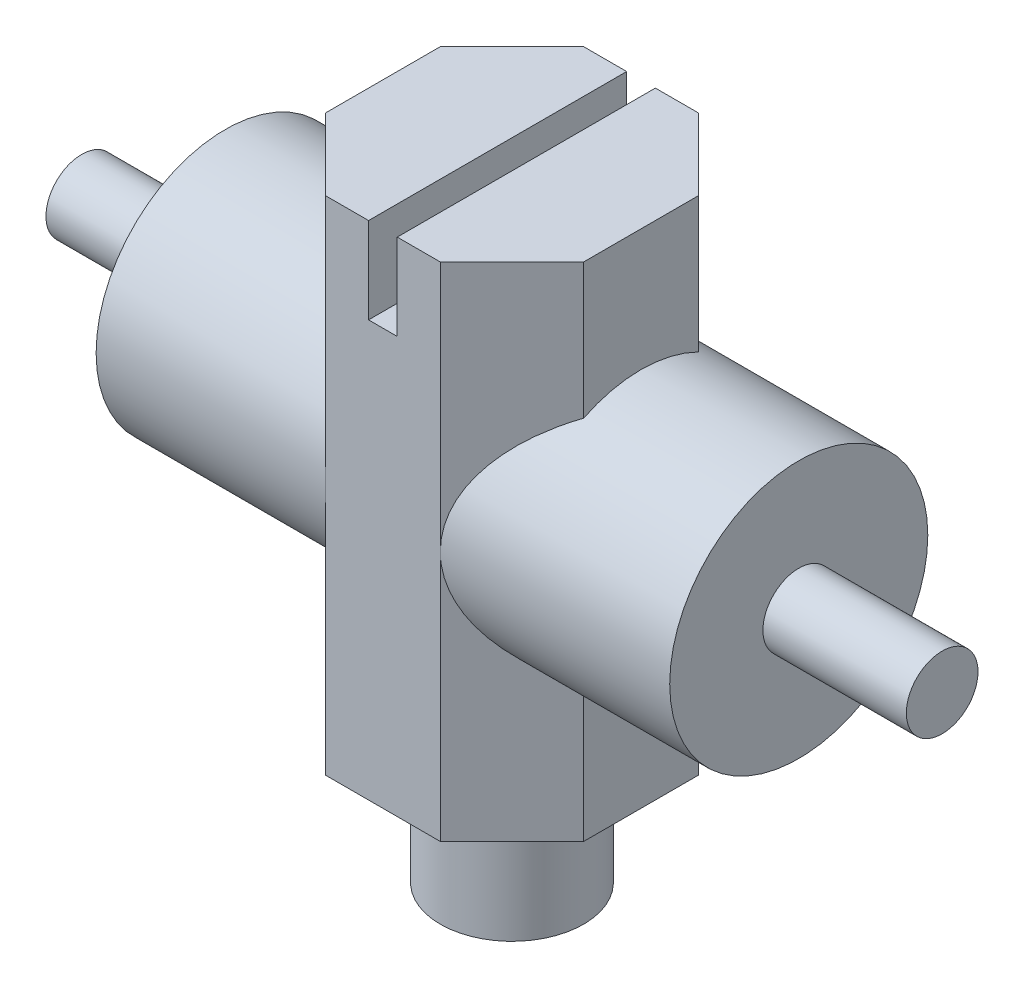
ISO-10303-21;
HEADER;
FILE_DESCRIPTION(('STEP AP214'),'2;1');
FILE_NAME('part.step','',(''),(''),'','','');
FILE_SCHEMA(('AUTOMOTIVE_DESIGN { 1 0 10303 214 1 1 1 1 }'));
ENDSEC;
DATA;
#1=APPLICATION_CONTEXT('core data for automotive mechanical design processes');
#2=APPLICATION_PROTOCOL_DEFINITION('international standard','automotive_design',2000,#1);
#3=PRODUCT_CONTEXT('',#1,'mechanical');
#4=PRODUCT('Part','Part','',(#3));
#5=PRODUCT_RELATED_PRODUCT_CATEGORY('part','',(#4));
#6=PRODUCT_DEFINITION_FORMATION('','',#4);
#7=PRODUCT_DEFINITION_CONTEXT('part definition',#1,'design');
#8=PRODUCT_DEFINITION('design','',#6,#7);
#9=PRODUCT_DEFINITION_SHAPE('','',#8);
#10=(LENGTH_UNIT() NAMED_UNIT(*) SI_UNIT(.MILLI.,.METRE.));
#11=(NAMED_UNIT(*) PLANE_ANGLE_UNIT() SI_UNIT($,.RADIAN.));
#12=(NAMED_UNIT(*) SI_UNIT($,.STERADIAN.) SOLID_ANGLE_UNIT());
#13=UNCERTAINTY_MEASURE_WITH_UNIT(LENGTH_MEASURE(1.E-05),#10,'distance_accuracy_value','');
#14=(GEOMETRIC_REPRESENTATION_CONTEXT(3) GLOBAL_UNCERTAINTY_ASSIGNED_CONTEXT((#13)) GLOBAL_UNIT_ASSIGNED_CONTEXT((#10,
#11,#12)) REPRESENTATION_CONTEXT('',''));
#15=CARTESIAN_POINT('',(0.,0.,0.));
#16=DIRECTION('',(0.,0.,1.));
#17=DIRECTION('',(1.,0.,0.));
#18=AXIS2_PLACEMENT_3D('',#15,#16,#17);
#19=CARTESIAN_POINT('',(0.,175.,0.));
#20=DIRECTION('',(0.,1.,0.));
#21=DIRECTION('',(0.,0.,1.));
#22=AXIS2_PLACEMENT_3D('',#19,#20,#21);
#23=PLANE('',#22);
#24=DIRECTION('',(0.,0.,1.));
#25=VECTOR('',#24,1.);
#26=CARTESIAN_POINT('',(290.,175.,-90.));
#27=LINE('',#26,#25);
#28=CARTESIAN_POINT('',(290.,175.,-90.));
#29=VERTEX_POINT('',#28);
#30=CARTESIAN_POINT('',(290.,175.,90.));
#31=VERTEX_POINT('',#30);
#32=EDGE_CURVE('E172',#29,#31,#27,.T.);
#33=ORIENTED_EDGE('',*,*,#32,.F.);
#34=DIRECTION('',(-1.,0.,0.));
#35=VECTOR('',#34,1.);
#36=CARTESIAN_POINT('',(210.,175.,-90.));
#37=LINE('',#36,#35);
#38=CARTESIAN_POINT('',(260.,175.,-90.));
#39=VERTEX_POINT('',#38);
#40=EDGE_CURVE('E222',#29,#39,#37,.T.);
#41=ORIENTED_EDGE('',*,*,#40,.T.);
#42=DIRECTION('',(0.707106781186549,0.,-0.707106781186546));
#43=VECTOR('',#42,1.);
#44=CARTESIAN_POINT('',(84.9999999999995,175.,84.9999999999998));
#45=LINE('',#44,#43);
#46=CARTESIAN_POINT('',(210.,175.,-40.0000000000002));
#47=VERTEX_POINT('',#46);
#48=EDGE_CURVE('E274',#39,#47,#45,.F.);
#49=ORIENTED_EDGE('',*,*,#48,.T.);
#50=DIRECTION('',(0.,0.,1.));
#51=VECTOR('',#50,1.);
#52=CARTESIAN_POINT('',(210.,175.,-90.));
#53=LINE('',#52,#51);
#54=CARTESIAN_POINT('',(210.,175.,39.9999999999998));
#55=VERTEX_POINT('',#54);
#56=EDGE_CURVE('E212',#47,#55,#53,.T.);
#57=ORIENTED_EDGE('',*,*,#56,.T.);
#58=DIRECTION('',(-0.707106781186546,0.,-0.707106781186549));
#59=VECTOR('',#58,1.);
#60=CARTESIAN_POINT('',(85.0000000000005,175.,-85.0000000000002));
#61=LINE('',#60,#59);
#62=CARTESIAN_POINT('',(260.,175.,90.));
#63=VERTEX_POINT('',#62);
#64=EDGE_CURVE('E278',#55,#63,#61,.F.);
#65=ORIENTED_EDGE('',*,*,#64,.T.);
#66=DIRECTION('',(1.,0.,0.));
#67=VECTOR('',#66,1.);
#68=CARTESIAN_POINT('',(210.,175.,90.));
#69=LINE('',#68,#67);
#70=EDGE_CURVE('E217',#63,#31,#69,.T.);
#71=ORIENTED_EDGE('',*,*,#70,.T.);
#72=EDGE_LOOP('',(#33,#41,#49,#57,#65,#71));
#73=FACE_BOUND('',#72,.T.);
#74=ADVANCED_FACE('F41',(#73),#23,.T.);
#75=CARTESIAN_POINT('',(0.,0.,0.));
#76=DIRECTION('',(1.,0.,0.));
#77=DIRECTION('',(0.,0.,-1.));
#78=AXIS2_PLACEMENT_3D('',#75,#76,#77);
#79=CYLINDRICAL_SURFACE('',#78,90.);
#80=CARTESIAN_POINT('',(100.,0.,0.));
#81=DIRECTION('',(1.,0.,0.));
#82=DIRECTION('',(0.,0.,-1.));
#83=AXIS2_PLACEMENT_3D('',#80,#81,#82);
#84=CIRCLE('',#83,90.);
#85=CARTESIAN_POINT('',(100.,0.,-90.));
#86=VERTEX_POINT('',#85);
#87=EDGE_CURVE('E245',#86,#86,#84,.T.);
#88=ORIENTED_EDGE('',*,*,#87,.T.);
#89=EDGE_LOOP('',(#88));
#90=FACE_BOUND('',#89,.T.);
#91=CARTESIAN_POINT('',(210.,0.,0.));
#92=DIRECTION('',(1.,0.,0.));
#93=DIRECTION('',(0.,0.,-1.));
#94=AXIS2_PLACEMENT_3D('',#91,#92,#93);
#95=CIRCLE('',#94,90.);
#96=CARTESIAN_POINT('',(210.,-80.6225774829854,-40.0000000000002));
#97=VERTEX_POINT('',#96);
#98=CARTESIAN_POINT('',(210.,-80.6225774829856,39.9999999999999));
#99=VERTEX_POINT('',#98);
#100=EDGE_CURVE('E211',#97,#99,#95,.F.);
#101=ORIENTED_EDGE('',*,*,#100,.T.);
#102=CARTESIAN_POINT('',(170.,0.,0.));
#103=DIRECTION('',(0.707106781186549,0.,-0.707106781186546));
#104=DIRECTION('',(0.707106781186546,0.,0.707106781186549));
#105=AXIS2_PLACEMENT_3D('',#102,#103,#104);
#106=ELLIPSE('',#105,127.279220613578,90.);
#107=CARTESIAN_POINT('',(260.,0.,90.));
#108=VERTEX_POINT('',#107);
#109=EDGE_CURVE('E320',#99,#108,#106,.F.);
#110=ORIENTED_EDGE('',*,*,#109,.T.);
#111=CARTESIAN_POINT('',(170.,0.,0.));
#112=DIRECTION('',(0.707106781186549,0.,-0.707106781186546));
#113=DIRECTION('',(0.707106781186546,0.,0.707106781186549));
#114=AXIS2_PLACEMENT_3D('',#111,#112,#113);
#115=ELLIPSE('',#114,127.279220613578,90.);
#116=CARTESIAN_POINT('',(210.,80.6225774829856,39.9999999999999));
#117=VERTEX_POINT('',#116);
#118=EDGE_CURVE('E318',#108,#117,#115,.F.);
#119=ORIENTED_EDGE('',*,*,#118,.T.);
#120=CARTESIAN_POINT('',(210.,80.6225774829854,-40.0000000000002));
#121=VERTEX_POINT('',#120);
#122=EDGE_CURVE('E257',#117,#121,#95,.F.);
#123=ORIENTED_EDGE('',*,*,#122,.T.);
#124=CARTESIAN_POINT('',(170.,0.,0.));
#125=DIRECTION('',(0.707106781186546,0.,0.707106781186549));
#126=DIRECTION('',(0.707106781186549,0.,-0.707106781186546));
#127=AXIS2_PLACEMENT_3D('',#124,#125,#126);
#128=ELLIPSE('',#127,127.279220613579,90.);
#129=CARTESIAN_POINT('',(260.,0.,-90.));
#130=VERTEX_POINT('',#129);
#131=EDGE_CURVE('E50',#121,#130,#128,.F.);
#132=ORIENTED_EDGE('',*,*,#131,.T.);
#133=CARTESIAN_POINT('',(170.,0.,0.));
#134=DIRECTION('',(0.707106781186546,0.,0.707106781186549));
#135=DIRECTION('',(0.707106781186549,0.,-0.707106781186546));
#136=AXIS2_PLACEMENT_3D('',#133,#134,#135);
#137=ELLIPSE('',#136,127.279220613579,90.);
#138=EDGE_CURVE('E11',#130,#97,#137,.F.);
#139=ORIENTED_EDGE('',*,*,#138,.T.);
#140=EDGE_LOOP('',(#101,#110,#119,#123,#132,#139));
#141=FACE_BOUND('',#140,.T.);
#142=ADVANCED_FACE('F328',(#90,#141),#79,.T.);
#143=CARTESIAN_POINT('',(0.,0.,0.));
#144=DIRECTION('',(-1.,0.,0.));
#145=DIRECTION('',(0.,0.,1.));
#146=AXIS2_PLACEMENT_3D('',#143,#144,#145);
#147=PLANE('',#146);
#148=CARTESIAN_POINT('',(0.,0.,0.));
#149=DIRECTION('',(1.,0.,0.));
#150=DIRECTION('',(0.,0.,-1.));
#151=AXIS2_PLACEMENT_3D('',#148,#149,#150);
#152=CIRCLE('',#151,25.);
#153=CARTESIAN_POINT('',(0.,0.,-25.));
#154=VERTEX_POINT('',#153);
#155=EDGE_CURVE('E251',#154,#154,#152,.T.);
#156=ORIENTED_EDGE('',*,*,#155,.F.);
#157=EDGE_LOOP('',(#156));
#158=FACE_BOUND('',#157,.T.);
#159=ADVANCED_FACE('F396',(#158),#147,.T.);
#160=CARTESIAN_POINT('',(0.,0.,0.));
#161=DIRECTION('',(1.,0.,0.));
#162=DIRECTION('',(0.,0.,-1.));
#163=AXIS2_PLACEMENT_3D('',#160,#161,#162);
#164=CYLINDRICAL_SURFACE('',#163,25.);
#165=ORIENTED_EDGE('',*,*,#155,.T.);
#166=EDGE_LOOP('',(#165));
#167=FACE_BOUND('',#166,.T.);
#168=CARTESIAN_POINT('',(100.,0.,0.));
#169=DIRECTION('',(1.,0.,0.));
#170=DIRECTION('',(0.,0.,-1.));
#171=AXIS2_PLACEMENT_3D('',#168,#169,#170);
#172=CIRCLE('',#171,25.);
#173=CARTESIAN_POINT('',(100.,0.,-25.));
#174=VERTEX_POINT('',#173);
#175=EDGE_CURVE('E248',#174,#174,#172,.T.);
#176=ORIENTED_EDGE('',*,*,#175,.F.);
#177=EDGE_LOOP('',(#176));
#178=FACE_BOUND('',#177,.T.);
#179=ADVANCED_FACE('F480',(#167,#178),#164,.T.);
#180=CARTESIAN_POINT('',(100.,25.,0.));
#181=DIRECTION('',(-1.,0.,0.));
#182=DIRECTION('',(0.,0.,1.));
#183=AXIS2_PLACEMENT_3D('',#180,#181,#182);
#184=PLANE('',#183);
#185=ORIENTED_EDGE('',*,*,#175,.T.);
#186=EDGE_LOOP('',(#185));
#187=FACE_BOUND('',#186,.T.);
#188=ORIENTED_EDGE('',*,*,#87,.F.);
#189=EDGE_LOOP('',(#188));
#190=FACE_BOUND('',#189,.T.);
#191=ADVANCED_FACE('F477',(#187,#190),#184,.T.);
#192=CARTESIAN_POINT('',(210.,175.,-90.));
#193=DIRECTION('',(1.,0.,0.));
#194=DIRECTION('',(0.,0.,-1.));
#195=AXIS2_PLACEMENT_3D('',#192,#193,#194);
#196=PLANE('',#195);
#197=DIRECTION('',(0.,0.,1.));
#198=VECTOR('',#197,1.);
#199=CARTESIAN_POINT('',(210.,-175.,-90.));
#200=LINE('',#199,#198);
#201=CARTESIAN_POINT('',(210.,-175.,-40.0000000000002));
#202=VERTEX_POINT('',#201);
#203=CARTESIAN_POINT('',(210.,-175.,39.9999999999998));
#204=VERTEX_POINT('',#203);
#205=EDGE_CURVE('E206',#202,#204,#200,.T.);
#206=ORIENTED_EDGE('',*,*,#205,.T.);
#207=DIRECTION('',(0.,1.,0.));
#208=VECTOR('',#207,1.);
#209=CARTESIAN_POINT('',(210.,175.,39.9999999999999));
#210=LINE('',#209,#208);
#211=EDGE_CURVE('E301',#204,#99,#210,.T.);
#212=ORIENTED_EDGE('',*,*,#211,.T.);
#213=ORIENTED_EDGE('',*,*,#100,.F.);
#214=DIRECTION('',(0.,-1.,0.));
#215=VECTOR('',#214,1.);
#216=CARTESIAN_POINT('',(210.,175.,-40.0000000000002));
#217=LINE('',#216,#215);
#218=EDGE_CURVE('E299',#97,#202,#217,.T.);
#219=ORIENTED_EDGE('',*,*,#218,.T.);
#220=EDGE_LOOP('',(#206,#212,#213,#219));
#221=FACE_BOUND('',#220,.T.);
#222=ADVANCED_FACE('F377',(#221),#196,.F.);
#223=CARTESIAN_POINT('',(210.,175.,90.));
#224=DIRECTION('',(0.,0.,-1.));
#225=DIRECTION('',(-1.,0.,0.));
#226=AXIS2_PLACEMENT_3D('',#223,#224,#225);
#227=PLANE('',#226);
#228=DIRECTION('',(1.,0.,0.));
#229=VECTOR('',#228,1.);
#230=CARTESIAN_POINT('',(290.,115.,90.));
#231=LINE('',#230,#229);
#232=CARTESIAN_POINT('',(290.,115.,90.));
#233=VERTEX_POINT('',#232);
#234=CARTESIAN_POINT('',(310.,115.,90.));
#235=VERTEX_POINT('',#234);
#236=EDGE_CURVE('E183',#233,#235,#231,.T.);
#237=ORIENTED_EDGE('',*,*,#236,.F.);
#238=DIRECTION('',(0.,1.,0.));
#239=VECTOR('',#238,1.);
#240=CARTESIAN_POINT('',(290.,115.,90.));
#241=LINE('',#240,#239);
#242=EDGE_CURVE('E166',#233,#31,#241,.T.);
#243=ORIENTED_EDGE('',*,*,#242,.T.);
#244=ORIENTED_EDGE('',*,*,#70,.F.);
#245=DIRECTION('',(0.,-1.,0.));
#246=VECTOR('',#245,1.);
#247=CARTESIAN_POINT('',(260.,175.,90.));
#248=LINE('',#247,#246);
#249=EDGE_CURVE('E266',#63,#108,#248,.T.);
#250=ORIENTED_EDGE('',*,*,#249,.T.);
#251=DIRECTION('',(0.,-1.,0.));
#252=VECTOR('',#251,1.);
#253=CARTESIAN_POINT('',(260.,175.,90.));
#254=LINE('',#253,#252);
#255=CARTESIAN_POINT('',(260.,-175.,90.));
#256=VERTEX_POINT('',#255);
#257=EDGE_CURVE('E264',#108,#256,#254,.T.);
#258=ORIENTED_EDGE('',*,*,#257,.T.);
#259=DIRECTION('',(1.,0.,0.));
#260=VECTOR('',#259,1.);
#261=CARTESIAN_POINT('',(210.,-175.,90.));
#262=LINE('',#261,#260);
#263=CARTESIAN_POINT('',(340.,-175.,90.));
#264=VERTEX_POINT('',#263);
#265=EDGE_CURVE('E229',#256,#264,#262,.T.);
#266=ORIENTED_EDGE('',*,*,#265,.T.);
#267=DIRECTION('',(0.,1.,0.));
#268=VECTOR('',#267,1.);
#269=CARTESIAN_POINT('',(340.,175.,90.));
#270=LINE('',#269,#268);
#271=CARTESIAN_POINT('',(340.,0.,90.));
#272=VERTEX_POINT('',#271);
#273=EDGE_CURVE('E269',#264,#272,#270,.T.);
#274=ORIENTED_EDGE('',*,*,#273,.T.);
#275=DIRECTION('',(0.,1.,0.));
#276=VECTOR('',#275,1.);
#277=CARTESIAN_POINT('',(340.,175.,90.));
#278=LINE('',#277,#276);
#279=CARTESIAN_POINT('',(340.,175.,90.));
#280=VERTEX_POINT('',#279);
#281=EDGE_CURVE('E271',#272,#280,#278,.T.);
#282=ORIENTED_EDGE('',*,*,#281,.T.);
#283=CARTESIAN_POINT('',(310.,175.,90.));
#284=VERTEX_POINT('',#283);
#285=EDGE_CURVE('E215',#284,#280,#69,.T.);
#286=ORIENTED_EDGE('',*,*,#285,.F.);
#287=DIRECTION('',(0.,1.,0.));
#288=VECTOR('',#287,1.);
#289=CARTESIAN_POINT('',(310.,115.,90.));
#290=LINE('',#289,#288);
#291=EDGE_CURVE('E57',#235,#284,#290,.T.);
#292=ORIENTED_EDGE('',*,*,#291,.F.);
#293=EDGE_LOOP('',(#237,#243,#244,#250,#258,#266,#274,#282,#286,#292));
#294=FACE_BOUND('',#293,.T.);
#295=ADVANCED_FACE('F188',(#294),#227,.F.);
#296=CARTESIAN_POINT('',(390.,175.,-90.));
#297=DIRECTION('',(-1.,0.,0.));
#298=DIRECTION('',(0.,0.,1.));
#299=AXIS2_PLACEMENT_3D('',#296,#297,#298);
#300=PLANE('',#299);
#301=CARTESIAN_POINT('',(390.,0.,0.));
#302=DIRECTION('',(-1.,0.,0.));
#303=DIRECTION('',(0.,0.,1.));
#304=AXIS2_PLACEMENT_3D('',#301,#302,#303);
#305=CIRCLE('',#304,90.);
#306=CARTESIAN_POINT('',(390.,-80.6225774829854,40.0000000000002));
#307=VERTEX_POINT('',#306);
#308=CARTESIAN_POINT('',(390.,-80.6225774829855,-40.));
#309=VERTEX_POINT('',#308);
#310=EDGE_CURVE('E255',#307,#309,#305,.F.);
#311=ORIENTED_EDGE('',*,*,#310,.F.);
#312=DIRECTION('',(0.,-1.,0.));
#313=VECTOR('',#312,1.);
#314=CARTESIAN_POINT('',(390.,175.,40.0000000000002));
#315=LINE('',#314,#313);
#316=CARTESIAN_POINT('',(390.,-175.,40.0000000000001));
#317=VERTEX_POINT('',#316);
#318=EDGE_CURVE('E284',#307,#317,#315,.T.);
#319=ORIENTED_EDGE('',*,*,#318,.T.);
#320=DIRECTION('',(0.,0.,-1.));
#321=VECTOR('',#320,1.);
#322=CARTESIAN_POINT('',(390.,-175.,-90.));
#323=LINE('',#322,#321);
#324=CARTESIAN_POINT('',(390.,-175.,-40.));
#325=VERTEX_POINT('',#324);
#326=EDGE_CURVE('E232',#317,#325,#323,.T.);
#327=ORIENTED_EDGE('',*,*,#326,.T.);
#328=DIRECTION('',(0.,1.,0.));
#329=VECTOR('',#328,1.);
#330=CARTESIAN_POINT('',(390.,175.,-40.));
#331=LINE('',#330,#329);
#332=EDGE_CURVE('E282',#325,#309,#331,.T.);
#333=ORIENTED_EDGE('',*,*,#332,.T.);
#334=EDGE_LOOP('',(#311,#319,#327,#333));
#335=FACE_BOUND('',#334,.T.);
#336=ADVANCED_FACE('F355',(#335),#300,.F.);
#337=CARTESIAN_POINT('',(210.,175.,-90.));
#338=DIRECTION('',(0.,0.,1.));
#339=DIRECTION('',(1.,0.,0.));
#340=AXIS2_PLACEMENT_3D('',#337,#338,#339);
#341=PLANE('',#340);
#342=ORIENTED_EDGE('',*,*,#40,.F.);
#343=DIRECTION('',(0.,1.,0.));
#344=VECTOR('',#343,1.);
#345=CARTESIAN_POINT('',(290.,115.,-90.));
#346=LINE('',#345,#344);
#347=CARTESIAN_POINT('',(290.,115.,-90.));
#348=VERTEX_POINT('',#347);
#349=EDGE_CURVE('E197',#348,#29,#346,.T.);
#350=ORIENTED_EDGE('',*,*,#349,.F.);
#351=DIRECTION('',(-1.,0.,0.));
#352=VECTOR('',#351,1.);
#353=CARTESIAN_POINT('',(290.,115.,-90.));
#354=LINE('',#353,#352);
#355=CARTESIAN_POINT('',(310.,115.,-90.));
#356=VERTEX_POINT('',#355);
#357=EDGE_CURVE('E177',#356,#348,#354,.T.);
#358=ORIENTED_EDGE('',*,*,#357,.F.);
#359=DIRECTION('',(0.,1.,0.));
#360=VECTOR('',#359,1.);
#361=CARTESIAN_POINT('',(310.,115.,-90.));
#362=LINE('',#361,#360);
#363=CARTESIAN_POINT('',(310.,175.,-90.));
#364=VERTEX_POINT('',#363);
#365=EDGE_CURVE('E200',#356,#364,#362,.T.);
#366=ORIENTED_EDGE('',*,*,#365,.T.);
#367=CARTESIAN_POINT('',(340.,175.,-90.));
#368=VERTEX_POINT('',#367);
#369=EDGE_CURVE('E223',#368,#364,#37,.T.);
#370=ORIENTED_EDGE('',*,*,#369,.F.);
#371=DIRECTION('',(0.,-1.,0.));
#372=VECTOR('',#371,1.);
#373=CARTESIAN_POINT('',(340.,175.,-90.));
#374=LINE('',#373,#372);
#375=CARTESIAN_POINT('',(340.,0.,-90.));
#376=VERTEX_POINT('',#375);
#377=EDGE_CURVE('E310',#368,#376,#374,.T.);
#378=ORIENTED_EDGE('',*,*,#377,.T.);
#379=DIRECTION('',(0.,-1.,0.));
#380=VECTOR('',#379,1.);
#381=CARTESIAN_POINT('',(340.,175.,-90.));
#382=LINE('',#381,#380);
#383=CARTESIAN_POINT('',(340.,-175.,-90.));
#384=VERTEX_POINT('',#383);
#385=EDGE_CURVE('E308',#376,#384,#382,.T.);
#386=ORIENTED_EDGE('',*,*,#385,.T.);
#387=DIRECTION('',(-1.,0.,0.));
#388=VECTOR('',#387,1.);
#389=CARTESIAN_POINT('',(210.,-175.,-90.));
#390=LINE('',#389,#388);
#391=CARTESIAN_POINT('',(260.,-175.,-90.));
#392=VERTEX_POINT('',#391);
#393=EDGE_CURVE('E216',#384,#392,#390,.T.);
#394=ORIENTED_EDGE('',*,*,#393,.T.);
#395=DIRECTION('',(0.,1.,0.));
#396=VECTOR('',#395,1.);
#397=CARTESIAN_POINT('',(260.,175.,-90.));
#398=LINE('',#397,#396);
#399=EDGE_CURVE('E303',#392,#130,#398,.T.);
#400=ORIENTED_EDGE('',*,*,#399,.T.);
#401=DIRECTION('',(0.,1.,0.));
#402=VECTOR('',#401,1.);
#403=CARTESIAN_POINT('',(260.,175.,-90.));
#404=LINE('',#403,#402);
#405=EDGE_CURVE('E305',#130,#39,#404,.T.);
#406=ORIENTED_EDGE('',*,*,#405,.T.);
#407=EDGE_LOOP('',(#342,#350,#358,#366,#370,#378,#386,#394,#400,#406));
#408=FACE_BOUND('',#407,.T.);
#409=ADVANCED_FACE('F342',(#408),#341,.F.);
#410=ORIENTED_EDGE('',*,*,#122,.F.);
#411=DIRECTION('',(0.,1.,0.));
#412=VECTOR('',#411,1.);
#413=CARTESIAN_POINT('',(210.,175.,39.9999999999999));
#414=LINE('',#413,#412);
#415=EDGE_CURVE('E297',#117,#55,#414,.T.);
#416=ORIENTED_EDGE('',*,*,#415,.T.);
#417=ORIENTED_EDGE('',*,*,#56,.F.);
#418=DIRECTION('',(0.,-1.,0.));
#419=VECTOR('',#418,1.);
#420=CARTESIAN_POINT('',(210.,175.,-40.0000000000002));
#421=LINE('',#420,#419);
#422=EDGE_CURVE('E294',#47,#121,#421,.T.);
#423=ORIENTED_EDGE('',*,*,#422,.T.);
#424=EDGE_LOOP('',(#410,#416,#417,#423));
#425=FACE_BOUND('',#424,.T.);
#426=ADVANCED_FACE('F386',(#425),#196,.F.);
#427=DIRECTION('',(0.,0.,-1.));
#428=VECTOR('',#427,1.);
#429=CARTESIAN_POINT('',(390.,175.,-90.));
#430=LINE('',#429,#428);
#431=CARTESIAN_POINT('',(390.,175.,40.0000000000001));
#432=VERTEX_POINT('',#431);
#433=CARTESIAN_POINT('',(390.,175.,-40.));
#434=VERTEX_POINT('',#433);
#435=EDGE_CURVE('E219',#432,#434,#430,.T.);
#436=ORIENTED_EDGE('',*,*,#435,.F.);
#437=DIRECTION('',(0.,-1.,0.));
#438=VECTOR('',#437,1.);
#439=CARTESIAN_POINT('',(390.,175.,40.0000000000002));
#440=LINE('',#439,#438);
#441=CARTESIAN_POINT('',(390.,80.6225774829854,40.0000000000002));
#442=VERTEX_POINT('',#441);
#443=EDGE_CURVE('E261',#432,#442,#440,.T.);
#444=ORIENTED_EDGE('',*,*,#443,.T.);
#445=CARTESIAN_POINT('',(390.,80.6225774829855,-40.));
#446=VERTEX_POINT('',#445);
#447=EDGE_CURVE('E254',#446,#442,#305,.F.);
#448=ORIENTED_EDGE('',*,*,#447,.F.);
#449=DIRECTION('',(0.,1.,0.));
#450=VECTOR('',#449,1.);
#451=CARTESIAN_POINT('',(390.,175.,-40.));
#452=LINE('',#451,#450);
#453=EDGE_CURVE('E210',#446,#434,#452,.T.);
#454=ORIENTED_EDGE('',*,*,#453,.T.);
#455=EDGE_LOOP('',(#436,#444,#448,#454));
#456=FACE_BOUND('',#455,.T.);
#457=ADVANCED_FACE('F402',(#456),#300,.F.);
#458=DIRECTION('',(0.,0.,-1.));
#459=VECTOR('',#458,1.);
#460=CARTESIAN_POINT('',(310.,175.,-90.));
#461=LINE('',#460,#459);
#462=EDGE_CURVE('E186',#284,#364,#461,.T.);
#463=ORIENTED_EDGE('',*,*,#462,.F.);
#464=ORIENTED_EDGE('',*,*,#285,.T.);
#465=DIRECTION('',(-0.707106781186549,0.,0.707106781186546));
#466=VECTOR('',#465,1.);
#467=CARTESIAN_POINT('',(214.999999999999,175.,215.));
#468=LINE('',#467,#466);
#469=EDGE_CURVE('E280',#280,#432,#468,.F.);
#470=ORIENTED_EDGE('',*,*,#469,.T.);
#471=ORIENTED_EDGE('',*,*,#435,.T.);
#472=DIRECTION('',(0.707106781186547,0.,0.707106781186548));
#473=VECTOR('',#472,1.);
#474=CARTESIAN_POINT('',(215.,175.,-215.));
#475=LINE('',#474,#473);
#476=EDGE_CURVE('E276',#434,#368,#475,.F.);
#477=ORIENTED_EDGE('',*,*,#476,.T.);
#478=ORIENTED_EDGE('',*,*,#369,.T.);
#479=EDGE_LOOP('',(#463,#464,#470,#471,#477,#478));
#480=FACE_BOUND('',#479,.T.);
#481=ADVANCED_FACE('F390',(#480),#23,.T.);
#482=CARTESIAN_POINT('',(0.,-175.,0.));
#483=DIRECTION('',(0.,1.,0.));
#484=DIRECTION('',(0.,0.,1.));
#485=AXIS2_PLACEMENT_3D('',#482,#483,#484);
#486=PLANE('',#485);
#487=CARTESIAN_POINT('',(300.,-175.,0.));
#488=DIRECTION('',(0.,-1.,0.));
#489=DIRECTION('',(0.,0.,-1.));
#490=AXIS2_PLACEMENT_3D('',#487,#488,#489);
#491=CIRCLE('',#490,50.);
#492=CARTESIAN_POINT('',(300.,-175.,50.));
#493=VERTEX_POINT('',#492);
#494=EDGE_CURVE('E207',#493,#493,#491,.T.);
#495=ORIENTED_EDGE('',*,*,#494,.F.);
#496=EDGE_LOOP('',(#495));
#497=FACE_BOUND('',#496,.T.);
#498=ORIENTED_EDGE('',*,*,#326,.F.);
#499=DIRECTION('',(0.707106781186549,0.,-0.707106781186546));
#500=VECTOR('',#499,1.);
#501=CARTESIAN_POINT('',(390.,-175.,40.0000000000002));
#502=LINE('',#501,#500);
#503=EDGE_CURVE('E292',#317,#264,#502,.F.);
#504=ORIENTED_EDGE('',*,*,#503,.T.);
#505=ORIENTED_EDGE('',*,*,#265,.F.);
#506=DIRECTION('',(0.707106781186546,0.,0.707106781186549));
#507=VECTOR('',#506,1.);
#508=CARTESIAN_POINT('',(260.,-175.,90.));
#509=LINE('',#508,#507);
#510=EDGE_CURVE('E290',#256,#204,#509,.F.);
#511=ORIENTED_EDGE('',*,*,#510,.T.);
#512=ORIENTED_EDGE('',*,*,#205,.F.);
#513=DIRECTION('',(-0.707106781186549,0.,0.707106781186546));
#514=VECTOR('',#513,1.);
#515=CARTESIAN_POINT('',(210.,-175.,-40.0000000000002));
#516=LINE('',#515,#514);
#517=EDGE_CURVE('E286',#202,#392,#516,.F.);
#518=ORIENTED_EDGE('',*,*,#517,.T.);
#519=ORIENTED_EDGE('',*,*,#393,.F.);
#520=DIRECTION('',(-0.707106781186547,0.,-0.707106781186548));
#521=VECTOR('',#520,1.);
#522=CARTESIAN_POINT('',(340.,-175.,-90.));
#523=LINE('',#522,#521);
#524=EDGE_CURVE('E288',#384,#325,#523,.F.);
#525=ORIENTED_EDGE('',*,*,#524,.T.);
#526=EDGE_LOOP('',(#498,#504,#505,#511,#512,#518,#519,#525));
#527=FACE_BOUND('',#526,.T.);
#528=ADVANCED_FACE('F348',(#497,#527),#486,.F.);
#529=CARTESIAN_POINT('',(600.,25.,0.));
#530=DIRECTION('',(1.,0.,0.));
#531=DIRECTION('',(0.,0.,-1.));
#532=AXIS2_PLACEMENT_3D('',#529,#530,#531);
#533=PLANE('',#532);
#534=CARTESIAN_POINT('',(600.,0.,0.));
#535=DIRECTION('',(1.,0.,0.));
#536=DIRECTION('',(0.,0.,-1.));
#537=AXIS2_PLACEMENT_3D('',#534,#535,#536);
#538=CIRCLE('',#537,25.);
#539=CARTESIAN_POINT('',(600.,0.,-25.));
#540=VERTEX_POINT('',#539);
#541=EDGE_CURVE('E226',#540,#540,#538,.T.);
#542=ORIENTED_EDGE('',*,*,#541,.T.);
#543=EDGE_LOOP('',(#542));
#544=FACE_BOUND('',#543,.T.);
#545=ADVANCED_FACE('F409',(#544),#533,.T.);
#546=CARTESIAN_POINT('',(0.,0.,0.));
#547=DIRECTION('',(1.,0.,0.));
#548=DIRECTION('',(0.,0.,-1.));
#549=AXIS2_PLACEMENT_3D('',#546,#547,#548);
#550=CYLINDRICAL_SURFACE('',#549,25.);
#551=CARTESIAN_POINT('',(500.,0.,0.));
#552=DIRECTION('',(1.,0.,0.));
#553=DIRECTION('',(0.,0.,-1.));
#554=AXIS2_PLACEMENT_3D('',#551,#552,#553);
#555=CIRCLE('',#554,25.);
#556=CARTESIAN_POINT('',(500.,0.,-25.));
#557=VERTEX_POINT('',#556);
#558=EDGE_CURVE('E239',#557,#557,#555,.T.);
#559=ORIENTED_EDGE('',*,*,#558,.T.);
#560=EDGE_LOOP('',(#559));
#561=FACE_BOUND('',#560,.T.);
#562=ORIENTED_EDGE('',*,*,#541,.F.);
#563=EDGE_LOOP('',(#562));
#564=FACE_BOUND('',#563,.T.);
#565=ADVANCED_FACE('F471',(#561,#564),#550,.T.);
#566=CARTESIAN_POINT('',(500.,90.,0.));
#567=DIRECTION('',(1.,0.,0.));
#568=DIRECTION('',(0.,0.,-1.));
#569=AXIS2_PLACEMENT_3D('',#566,#567,#568);
#570=PLANE('',#569);
#571=CARTESIAN_POINT('',(500.,0.,0.));
#572=DIRECTION('',(1.,0.,0.));
#573=DIRECTION('',(0.,0.,-1.));
#574=AXIS2_PLACEMENT_3D('',#571,#572,#573);
#575=CIRCLE('',#574,90.);
#576=CARTESIAN_POINT('',(500.,0.,-90.));
#577=VERTEX_POINT('',#576);
#578=EDGE_CURVE('E242',#577,#577,#575,.T.);
#579=ORIENTED_EDGE('',*,*,#578,.T.);
#580=EDGE_LOOP('',(#579));
#581=FACE_BOUND('',#580,.T.);
#582=ORIENTED_EDGE('',*,*,#558,.F.);
#583=EDGE_LOOP('',(#582));
#584=FACE_BOUND('',#583,.T.);
#585=ADVANCED_FACE('F462',(#581,#584),#570,.T.);
#586=ORIENTED_EDGE('',*,*,#578,.F.);
#587=EDGE_LOOP('',(#586));
#588=FACE_BOUND('',#587,.T.);
#589=ORIENTED_EDGE('',*,*,#310,.T.);
#590=CARTESIAN_POINT('',(430.,0.,0.));
#591=DIRECTION('',(-0.707106781186548,0.,0.707106781186547));
#592=DIRECTION('',(0.707106781186547,0.,0.707106781186548));
#593=AXIS2_PLACEMENT_3D('',#590,#591,#592);
#594=ELLIPSE('',#593,127.279220613578,90.);
#595=EDGE_CURVE('E65',#309,#376,#594,.F.);
#596=ORIENTED_EDGE('',*,*,#595,.T.);
#597=CARTESIAN_POINT('',(430.,0.,0.));
#598=DIRECTION('',(-0.707106781186548,0.,0.707106781186547));
#599=DIRECTION('',(0.707106781186547,0.,0.707106781186548));
#600=AXIS2_PLACEMENT_3D('',#597,#598,#599);
#601=ELLIPSE('',#600,127.279220613578,90.);
#602=EDGE_CURVE('E322',#376,#446,#601,.F.);
#603=ORIENTED_EDGE('',*,*,#602,.T.);
#604=ORIENTED_EDGE('',*,*,#447,.T.);
#605=CARTESIAN_POINT('',(430.,0.,0.));
#606=DIRECTION('',(-0.707106781186546,0.,-0.707106781186549));
#607=DIRECTION('',(0.707106781186549,0.,-0.707106781186546));
#608=AXIS2_PLACEMENT_3D('',#605,#606,#607);
#609=ELLIPSE('',#608,127.279220613579,90.);
#610=EDGE_CURVE('E313',#442,#272,#609,.F.);
#611=ORIENTED_EDGE('',*,*,#610,.T.);
#612=CARTESIAN_POINT('',(430.,0.,0.));
#613=DIRECTION('',(-0.707106781186546,0.,-0.707106781186549));
#614=DIRECTION('',(0.707106781186549,0.,-0.707106781186546));
#615=AXIS2_PLACEMENT_3D('',#612,#613,#614);
#616=ELLIPSE('',#615,127.279220613579,90.);
#617=EDGE_CURVE('E316',#272,#307,#616,.F.);
#618=ORIENTED_EDGE('',*,*,#617,.T.);
#619=EDGE_LOOP('',(#589,#596,#603,#604,#611,#618));
#620=FACE_BOUND('',#619,.T.);
#621=ADVANCED_FACE('F357',(#588,#620),#79,.T.);
#622=CARTESIAN_POINT('',(300.,-265.,0.));
#623=DIRECTION('',(0.,1.,0.));
#624=DIRECTION('',(0.,0.,1.));
#625=AXIS2_PLACEMENT_3D('',#622,#623,#624);
#626=CYLINDRICAL_SURFACE('',#625,50.);
#627=CARTESIAN_POINT('',(300.,-265.,0.));
#628=DIRECTION('',(0.,-1.,0.));
#629=DIRECTION('',(0.,0.,-1.));
#630=AXIS2_PLACEMENT_3D('',#627,#628,#629);
#631=CIRCLE('',#630,50.);
#632=CARTESIAN_POINT('',(300.,-265.,50.));
#633=VERTEX_POINT('',#632);
#634=EDGE_CURVE('E199',#633,#633,#631,.T.);
#635=CARTESIAN_POINT('',(300.,-265.,50.));
#636=CARTESIAN_POINT('',(300.,-264.0625,50.));
#637=CARTESIAN_POINT('',(300.,-263.125,50.));
#638=CARTESIAN_POINT('',(300.,-261.25,50.));
#639=CARTESIAN_POINT('',(300.,-260.3125,50.));
#640=CARTESIAN_POINT('',(300.,-258.4375,50.));
#641=CARTESIAN_POINT('',(300.,-257.5,50.));
#642=CARTESIAN_POINT('',(300.,-255.625,50.));
#643=CARTESIAN_POINT('',(300.,-254.6875,50.));
#644=CARTESIAN_POINT('',(300.,-252.8125,50.));
#645=CARTESIAN_POINT('',(300.,-251.875,50.));
#646=CARTESIAN_POINT('',(300.,-250.,50.));
#647=CARTESIAN_POINT('',(300.,-249.0625,50.));
#648=CARTESIAN_POINT('',(300.,-247.1875,50.));
#649=CARTESIAN_POINT('',(300.,-246.25,50.));
#650=CARTESIAN_POINT('',(300.,-244.375,50.));
#651=CARTESIAN_POINT('',(300.,-243.4375,50.));
#652=CARTESIAN_POINT('',(300.,-241.5625,50.));
#653=CARTESIAN_POINT('',(300.,-240.625,50.));
#654=CARTESIAN_POINT('',(300.,-238.75,50.));
#655=CARTESIAN_POINT('',(300.,-237.8125,50.));
#656=CARTESIAN_POINT('',(300.,-235.9375,50.));
#657=CARTESIAN_POINT('',(300.,-235.,50.));
#658=CARTESIAN_POINT('',(300.,-233.125,50.));
#659=CARTESIAN_POINT('',(300.,-232.1875,50.));
#660=CARTESIAN_POINT('',(300.,-230.3125,50.));
#661=CARTESIAN_POINT('',(300.,-229.375,50.));
#662=CARTESIAN_POINT('',(300.,-227.5,50.));
#663=CARTESIAN_POINT('',(300.,-226.5625,50.));
#664=CARTESIAN_POINT('',(300.,-224.6875,50.));
#665=CARTESIAN_POINT('',(300.,-223.75,50.));
#666=CARTESIAN_POINT('',(300.,-221.875,50.));
#667=CARTESIAN_POINT('',(300.,-220.9375,50.));
#668=CARTESIAN_POINT('',(300.,-219.0625,50.));
#669=CARTESIAN_POINT('',(300.,-218.125,50.));
#670=CARTESIAN_POINT('',(300.,-216.25,50.));
#671=CARTESIAN_POINT('',(300.,-215.3125,50.));
#672=CARTESIAN_POINT('',(300.,-213.4375,50.));
#673=CARTESIAN_POINT('',(300.,-212.5,50.));
#674=CARTESIAN_POINT('',(300.,-210.625,50.));
#675=CARTESIAN_POINT('',(300.,-209.6875,50.));
#676=CARTESIAN_POINT('',(300.,-207.8125,50.));
#677=CARTESIAN_POINT('',(300.,-206.875,50.));
#678=CARTESIAN_POINT('',(300.,-205.,50.));
#679=CARTESIAN_POINT('',(300.,-204.0625,50.));
#680=CARTESIAN_POINT('',(300.,-202.1875,50.));
#681=CARTESIAN_POINT('',(300.,-201.25,50.));
#682=CARTESIAN_POINT('',(300.,-199.375,50.));
#683=CARTESIAN_POINT('',(300.,-198.4375,50.));
#684=CARTESIAN_POINT('',(300.,-196.5625,50.));
#685=CARTESIAN_POINT('',(300.,-195.625,50.));
#686=CARTESIAN_POINT('',(300.,-193.75,50.));
#687=CARTESIAN_POINT('',(300.,-192.8125,50.));
#688=CARTESIAN_POINT('',(300.,-190.9375,50.));
#689=CARTESIAN_POINT('',(300.,-190.,50.));
#690=CARTESIAN_POINT('',(300.,-188.125,50.));
#691=CARTESIAN_POINT('',(300.,-187.1875,50.));
#692=CARTESIAN_POINT('',(300.,-185.3125,50.));
#693=CARTESIAN_POINT('',(300.,-184.375,50.));
#694=CARTESIAN_POINT('',(300.,-182.5,50.));
#695=CARTESIAN_POINT('',(300.,-181.5625,50.));
#696=CARTESIAN_POINT('',(300.,-179.6875,50.));
#697=CARTESIAN_POINT('',(300.,-178.75,50.));
#698=CARTESIAN_POINT('',(300.,-176.875,50.));
#699=CARTESIAN_POINT('',(300.,-175.9375,50.));
#700=CARTESIAN_POINT('',(300.,-175.,50.));
#701=B_SPLINE_CURVE_WITH_KNOTS('',3,(#635,#636,#637,#638,#639,#640,#641,#642,#643,#644,#645,
#646,#647,#648,#649,#650,#651,#652,#653,#654,#655,#656,#657,#658,#659,#660,#661,#662,#663,#664,
#665,#666,#667,#668,#669,#670,#671,#672,#673,#674,#675,#676,#677,#678,#679,#680,#681,#682,#683,
#684,#685,#686,#687,#688,#689,#690,#691,#692,#693,#694,#695,#696,#697,#698,#699,#700),
.UNSPECIFIED.,.F.,.F.,(4,2,2,2,2,2,2,2,2,2,2,2,2,2,2,2,2,2,2,2,2,2,2,2,2,2,2,2,2,2,2,2,4),(0.,
2.81250000000005,5.62500000000005,8.43750000000004,11.25,14.0625,16.875,19.6875,22.5,25.3125,
28.125,30.9375,33.75,36.5625,39.375,42.1875,45.,47.8125,50.625,53.4375,56.25,59.0625,61.875,
64.6875,67.5,70.3125,73.1250000000001,75.9375,78.75,81.5625,84.375,87.1875,90.),.UNSPECIFIED.);
#702=EDGE_CURVE('BSEAM454',#633,#493,#701,.T.);
#703=ORIENTED_EDGE('',*,*,#634,.F.);
#704=ORIENTED_EDGE('',*,*,#494,.T.);
#705=ORIENTED_EDGE('',*,*,#702,.T.);
#706=ORIENTED_EDGE('',*,*,#702,.F.);
#707=EDGE_LOOP('',(#703,#705,#704,#706));
#708=FACE_BOUND('',#707,.T.);
#709=ADVANCED_FACE('F454',(#708),#626,.T.);
#710=CARTESIAN_POINT('',(300.,-265.,0.));
#711=DIRECTION('',(0.,-1.,0.));
#712=DIRECTION('',(0.,0.,-1.));
#713=AXIS2_PLACEMENT_3D('',#710,#711,#712);
#714=PLANE('',#713);
#715=ORIENTED_EDGE('',*,*,#634,.T.);
#716=EDGE_LOOP('',(#715));
#717=FACE_BOUND('',#716,.T.);
#718=ADVANCED_FACE('F452',(#717),#714,.T.);
#719=CARTESIAN_POINT('',(390.,175.,40.0000000000002));
#720=DIRECTION('',(-0.707106781186546,0.,-0.707106781186549));
#721=DIRECTION('',(0.,-1.,0.));
#722=AXIS2_PLACEMENT_3D('',#719,#720,#721);
#723=PLANE('',#722);
#724=ORIENTED_EDGE('',*,*,#318,.F.);
#725=ORIENTED_EDGE('',*,*,#617,.F.);
#726=ORIENTED_EDGE('',*,*,#273,.F.);
#727=ORIENTED_EDGE('',*,*,#503,.F.);
#728=EDGE_LOOP('',(#724,#725,#726,#727));
#729=FACE_BOUND('',#728,.T.);
#730=ADVANCED_FACE('F363',(#729),#723,.F.);
#731=CARTESIAN_POINT('',(390.,175.,40.0000000000002));
#732=DIRECTION('',(-0.707106781186546,0.,-0.707106781186549));
#733=DIRECTION('',(0.,-1.,0.));
#734=AXIS2_PLACEMENT_3D('',#731,#732,#733);
#735=PLANE('',#734);
#736=ORIENTED_EDGE('',*,*,#469,.F.);
#737=ORIENTED_EDGE('',*,*,#281,.F.);
#738=ORIENTED_EDGE('',*,*,#610,.F.);
#739=ORIENTED_EDGE('',*,*,#443,.F.);
#740=EDGE_LOOP('',(#736,#737,#738,#739));
#741=FACE_BOUND('',#740,.T.);
#742=ADVANCED_FACE('F367',(#741),#735,.F.);
#743=CARTESIAN_POINT('',(260.,175.,90.));
#744=DIRECTION('',(0.707106781186549,0.,-0.707106781186546));
#745=DIRECTION('',(0.,-1.,0.));
#746=AXIS2_PLACEMENT_3D('',#743,#744,#745);
#747=PLANE('',#746);
#748=ORIENTED_EDGE('',*,*,#510,.F.);
#749=ORIENTED_EDGE('',*,*,#257,.F.);
#750=ORIENTED_EDGE('',*,*,#109,.F.);
#751=ORIENTED_EDGE('',*,*,#211,.F.);
#752=EDGE_LOOP('',(#748,#749,#750,#751));
#753=FACE_BOUND('',#752,.T.);
#754=ADVANCED_FACE('F374',(#753),#747,.F.);
#755=CARTESIAN_POINT('',(260.,175.,90.));
#756=DIRECTION('',(0.707106781186549,0.,-0.707106781186546));
#757=DIRECTION('',(0.,-1.,0.));
#758=AXIS2_PLACEMENT_3D('',#755,#756,#757);
#759=PLANE('',#758);
#760=ORIENTED_EDGE('',*,*,#64,.F.);
#761=ORIENTED_EDGE('',*,*,#415,.F.);
#762=ORIENTED_EDGE('',*,*,#118,.F.);
#763=ORIENTED_EDGE('',*,*,#249,.F.);
#764=EDGE_LOOP('',(#760,#761,#762,#763));
#765=FACE_BOUND('',#764,.T.);
#766=ADVANCED_FACE('F383',(#765),#759,.F.);
#767=CARTESIAN_POINT('',(340.,175.,-90.));
#768=DIRECTION('',(-0.707106781186548,0.,0.707106781186547));
#769=DIRECTION('',(0.,-1.,0.));
#770=AXIS2_PLACEMENT_3D('',#767,#768,#769);
#771=PLANE('',#770);
#772=ORIENTED_EDGE('',*,*,#524,.F.);
#773=ORIENTED_EDGE('',*,*,#385,.F.);
#774=ORIENTED_EDGE('',*,*,#595,.F.);
#775=ORIENTED_EDGE('',*,*,#332,.F.);
#776=EDGE_LOOP('',(#772,#773,#774,#775));
#777=FACE_BOUND('',#776,.T.);
#778=ADVANCED_FACE('F352',(#777),#771,.F.);
#779=CARTESIAN_POINT('',(340.,175.,-90.));
#780=DIRECTION('',(-0.707106781186548,0.,0.707106781186547));
#781=DIRECTION('',(0.,-1.,0.));
#782=AXIS2_PLACEMENT_3D('',#779,#780,#781);
#783=PLANE('',#782);
#784=ORIENTED_EDGE('',*,*,#476,.F.);
#785=ORIENTED_EDGE('',*,*,#453,.F.);
#786=ORIENTED_EDGE('',*,*,#602,.F.);
#787=ORIENTED_EDGE('',*,*,#377,.F.);
#788=EDGE_LOOP('',(#784,#785,#786,#787));
#789=FACE_BOUND('',#788,.T.);
#790=ADVANCED_FACE('F419',(#789),#783,.F.);
#791=CARTESIAN_POINT('',(210.,175.,-40.0000000000002));
#792=DIRECTION('',(0.707106781186546,0.,0.707106781186549));
#793=DIRECTION('',(0.,-1.,0.));
#794=AXIS2_PLACEMENT_3D('',#791,#792,#793);
#795=PLANE('',#794);
#796=ORIENTED_EDGE('',*,*,#218,.F.);
#797=ORIENTED_EDGE('',*,*,#138,.F.);
#798=ORIENTED_EDGE('',*,*,#399,.F.);
#799=ORIENTED_EDGE('',*,*,#517,.F.);
#800=EDGE_LOOP('',(#796,#797,#798,#799));
#801=FACE_BOUND('',#800,.T.);
#802=ADVANCED_FACE('F44',(#801),#795,.F.);
#803=CARTESIAN_POINT('',(210.,175.,-40.0000000000002));
#804=DIRECTION('',(0.707106781186546,0.,0.707106781186549));
#805=DIRECTION('',(0.,-1.,0.));
#806=AXIS2_PLACEMENT_3D('',#803,#804,#805);
#807=PLANE('',#806);
#808=ORIENTED_EDGE('',*,*,#48,.F.);
#809=ORIENTED_EDGE('',*,*,#405,.F.);
#810=ORIENTED_EDGE('',*,*,#131,.F.);
#811=ORIENTED_EDGE('',*,*,#422,.F.);
#812=EDGE_LOOP('',(#808,#809,#810,#811));
#813=FACE_BOUND('',#812,.T.);
#814=ADVANCED_FACE('F339',(#813),#807,.F.);
#815=CARTESIAN_POINT('',(290.,115.,-90.));
#816=DIRECTION('',(-1.,0.,0.));
#817=DIRECTION('',(0.,0.,1.));
#818=AXIS2_PLACEMENT_3D('',#815,#816,#817);
#819=PLANE('',#818);
#820=ORIENTED_EDGE('',*,*,#32,.T.);
#821=ORIENTED_EDGE('',*,*,#242,.F.);
#822=DIRECTION('',(0.,0.,1.));
#823=VECTOR('',#822,1.);
#824=CARTESIAN_POINT('',(290.,115.,-90.));
#825=LINE('',#824,#823);
#826=EDGE_CURVE('E169',#348,#233,#825,.T.);
#827=ORIENTED_EDGE('',*,*,#826,.F.);
#828=ORIENTED_EDGE('',*,*,#349,.T.);
#829=EDGE_LOOP('',(#820,#821,#827,#828));
#830=FACE_BOUND('',#829,.T.);
#831=ADVANCED_FACE('F168',(#830),#819,.F.);
#832=CARTESIAN_POINT('',(310.,115.,-90.));
#833=DIRECTION('',(1.,0.,0.));
#834=DIRECTION('',(0.,0.,-1.));
#835=AXIS2_PLACEMENT_3D('',#832,#833,#834);
#836=PLANE('',#835);
#837=ORIENTED_EDGE('',*,*,#462,.T.);
#838=ORIENTED_EDGE('',*,*,#365,.F.);
#839=DIRECTION('',(0.,0.,-1.));
#840=VECTOR('',#839,1.);
#841=CARTESIAN_POINT('',(310.,115.,-90.));
#842=LINE('',#841,#840);
#843=EDGE_CURVE('E190',#235,#356,#842,.T.);
#844=ORIENTED_EDGE('',*,*,#843,.F.);
#845=ORIENTED_EDGE('',*,*,#291,.T.);
#846=EDGE_LOOP('',(#837,#838,#844,#845));
#847=FACE_BOUND('',#846,.T.);
#848=ADVANCED_FACE('F415',(#847),#836,.F.);
#849=CARTESIAN_POINT('',(0.,115.,0.));
#850=DIRECTION('',(0.,1.,0.));
#851=DIRECTION('',(0.,0.,1.));
#852=AXIS2_PLACEMENT_3D('',#849,#850,#851);
#853=PLANE('',#852);
#854=ORIENTED_EDGE('',*,*,#826,.T.);
#855=ORIENTED_EDGE('',*,*,#236,.T.);
#856=ORIENTED_EDGE('',*,*,#843,.T.);
#857=ORIENTED_EDGE('',*,*,#357,.T.);
#858=EDGE_LOOP('',(#854,#855,#856,#857));
#859=FACE_BOUND('',#858,.T.);
#860=ADVANCED_FACE('F181',(#859),#853,.T.);
#861=CLOSED_SHELL('',(#74,#142,#159,#179,#191,#222,#295,#336,#409,#426,#457,#481,#528,#545,#565,
#585,#621,#709,#718,#730,#742,#754,#766,#778,#790,#802,#814,#831,#848,#860));
#862=MANIFOLD_SOLID_BREP('B2',#861);
#863=ADVANCED_BREP_SHAPE_REPRESENTATION('',(#18,#862),#14);
#864=SHAPE_DEFINITION_REPRESENTATION(#9,#863);
ENDSEC;
END-ISO-10303-21;
